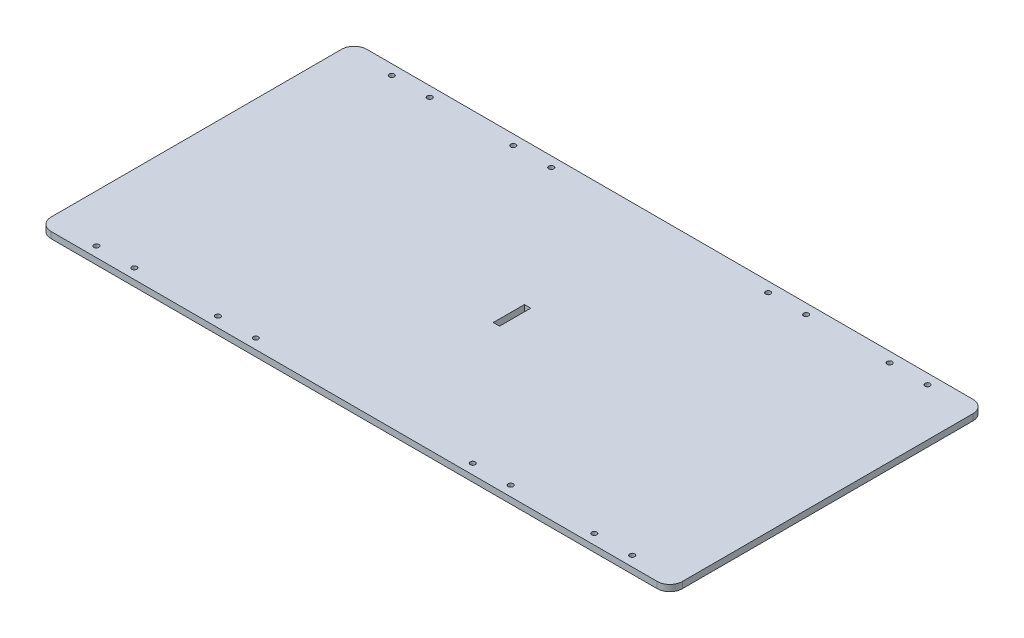
ISO-10303-21;
HEADER;
FILE_DESCRIPTION(('STEP AP214'),'2;1');
FILE_NAME('part.step','',(''),(''),'','','');
FILE_SCHEMA(('AUTOMOTIVE_DESIGN { 1 0 10303 214 1 1 1 1 }'));
ENDSEC;
DATA;
#1=APPLICATION_CONTEXT('core data for automotive mechanical design processes');
#2=APPLICATION_PROTOCOL_DEFINITION('international standard','automotive_design',2000,#1);
#3=PRODUCT_CONTEXT('',#1,'mechanical');
#4=PRODUCT('Part','Part','',(#3));
#5=PRODUCT_RELATED_PRODUCT_CATEGORY('part','',(#4));
#6=PRODUCT_DEFINITION_FORMATION('','',#4);
#7=PRODUCT_DEFINITION_CONTEXT('part definition',#1,'design');
#8=PRODUCT_DEFINITION('design','',#6,#7);
#9=PRODUCT_DEFINITION_SHAPE('','',#8);
#10=(LENGTH_UNIT() NAMED_UNIT(*) SI_UNIT(.MILLI.,.METRE.));
#11=(NAMED_UNIT(*) PLANE_ANGLE_UNIT() SI_UNIT($,.RADIAN.));
#12=(NAMED_UNIT(*) SI_UNIT($,.STERADIAN.) SOLID_ANGLE_UNIT());
#13=UNCERTAINTY_MEASURE_WITH_UNIT(LENGTH_MEASURE(1.E-05),#10,'distance_accuracy_value','');
#14=(GEOMETRIC_REPRESENTATION_CONTEXT(3) GLOBAL_UNCERTAINTY_ASSIGNED_CONTEXT((#13)) GLOBAL_UNIT_ASSIGNED_CONTEXT((#10,
#11,#12)) REPRESENTATION_CONTEXT('',''));
#15=CARTESIAN_POINT('',(0.,0.,0.));
#16=DIRECTION('',(0.,0.,1.));
#17=DIRECTION('',(1.,0.,0.));
#18=AXIS2_PLACEMENT_3D('',#15,#16,#17);
#19=CARTESIAN_POINT('',(240.,5.,-115.));
#20=DIRECTION('',(0.,-1.,0.));
#21=DIRECTION('',(0.,0.,-1.));
#22=AXIS2_PLACEMENT_3D('',#19,#20,#21);
#23=CYLINDRICAL_SURFACE('',#22,10.);
#24=CARTESIAN_POINT('',(240.,0.,-115.));
#25=DIRECTION('',(0.,1.,0.));
#26=DIRECTION('',(0.,0.,1.));
#27=AXIS2_PLACEMENT_3D('',#24,#25,#26);
#28=CIRCLE('',#27,10.);
#29=CARTESIAN_POINT('',(250.,0.,-115.));
#30=VERTEX_POINT('',#29);
#31=CARTESIAN_POINT('',(240.,0.,-125.));
#32=VERTEX_POINT('',#31);
#33=EDGE_CURVE('E263',#30,#32,#28,.T.);
#34=ORIENTED_EDGE('',*,*,#33,.T.);
#35=DIRECTION('',(0.,-1.,0.));
#36=VECTOR('',#35,1.);
#37=CARTESIAN_POINT('',(240.,5.,-125.));
#38=LINE('',#37,#36);
#39=CARTESIAN_POINT('',(240.,5.,-125.));
#40=VERTEX_POINT('',#39);
#41=EDGE_CURVE('E315',#40,#32,#38,.T.);
#42=ORIENTED_EDGE('',*,*,#41,.F.);
#43=CARTESIAN_POINT('',(240.,5.,-115.));
#44=DIRECTION('',(0.,1.,0.));
#45=DIRECTION('',(0.,0.,1.));
#46=AXIS2_PLACEMENT_3D('',#43,#44,#45);
#47=CIRCLE('',#46,10.);
#48=CARTESIAN_POINT('',(250.,5.,-115.));
#49=VERTEX_POINT('',#48);
#50=EDGE_CURVE('E236',#49,#40,#47,.T.);
#51=ORIENTED_EDGE('',*,*,#50,.F.);
#52=DIRECTION('',(0.,-1.,0.));
#53=VECTOR('',#52,1.);
#54=CARTESIAN_POINT('',(250.,5.,-115.));
#55=LINE('',#54,#53);
#56=EDGE_CURVE('E262',#49,#30,#55,.T.);
#57=ORIENTED_EDGE('',*,*,#56,.T.);
#58=EDGE_LOOP('',(#34,#42,#51,#57));
#59=FACE_BOUND('',#58,.T.);
#60=ADVANCED_FACE('F47',(#59),#23,.T.);
#61=CARTESIAN_POINT('',(240.,5.,-125.));
#62=DIRECTION('',(0.,0.,1.));
#63=DIRECTION('',(1.,0.,0.));
#64=AXIS2_PLACEMENT_3D('',#61,#62,#63);
#65=PLANE('',#64);
#66=DIRECTION('',(-1.,0.,0.));
#67=VECTOR('',#66,1.);
#68=CARTESIAN_POINT('',(240.,0.,-125.));
#69=LINE('',#68,#67);
#70=CARTESIAN_POINT('',(-240.,0.,-125.));
#71=VERTEX_POINT('',#70);
#72=EDGE_CURVE('E267',#32,#71,#69,.T.);
#73=ORIENTED_EDGE('',*,*,#72,.T.);
#74=DIRECTION('',(0.,-1.,0.));
#75=VECTOR('',#74,1.);
#76=CARTESIAN_POINT('',(-240.,5.,-125.));
#77=LINE('',#76,#75);
#78=CARTESIAN_POINT('',(-240.,5.,-125.));
#79=VERTEX_POINT('',#78);
#80=EDGE_CURVE('E311',#79,#71,#77,.T.);
#81=ORIENTED_EDGE('',*,*,#80,.F.);
#82=DIRECTION('',(-1.,0.,0.));
#83=VECTOR('',#82,1.);
#84=CARTESIAN_POINT('',(240.,5.,-125.));
#85=LINE('',#84,#83);
#86=EDGE_CURVE('E240',#40,#79,#85,.T.);
#87=ORIENTED_EDGE('',*,*,#86,.F.);
#88=ORIENTED_EDGE('',*,*,#41,.T.);
#89=EDGE_LOOP('',(#73,#81,#87,#88));
#90=FACE_BOUND('',#89,.T.);
#91=ADVANCED_FACE('F409',(#90),#65,.F.);
#92=CARTESIAN_POINT('',(-240.,5.,-115.));
#93=DIRECTION('',(0.,-1.,0.));
#94=DIRECTION('',(0.,0.,-1.));
#95=AXIS2_PLACEMENT_3D('',#92,#93,#94);
#96=CYLINDRICAL_SURFACE('',#95,10.);
#97=CARTESIAN_POINT('',(-240.,0.,-115.));
#98=DIRECTION('',(0.,1.,0.));
#99=DIRECTION('',(0.,0.,1.));
#100=AXIS2_PLACEMENT_3D('',#97,#98,#99);
#101=CIRCLE('',#100,10.);
#102=CARTESIAN_POINT('',(-250.,0.,-115.));
#103=VERTEX_POINT('',#102);
#104=EDGE_CURVE('E271',#71,#103,#101,.T.);
#105=ORIENTED_EDGE('',*,*,#104,.T.);
#106=DIRECTION('',(0.,-1.,0.));
#107=VECTOR('',#106,1.);
#108=CARTESIAN_POINT('',(-250.,5.,-115.));
#109=LINE('',#108,#107);
#110=CARTESIAN_POINT('',(-250.,5.,-115.));
#111=VERTEX_POINT('',#110);
#112=EDGE_CURVE('E307',#111,#103,#109,.T.);
#113=ORIENTED_EDGE('',*,*,#112,.F.);
#114=CARTESIAN_POINT('',(-240.,5.,-115.));
#115=DIRECTION('',(0.,1.,0.));
#116=DIRECTION('',(0.,0.,1.));
#117=AXIS2_PLACEMENT_3D('',#114,#115,#116);
#118=CIRCLE('',#117,10.);
#119=EDGE_CURVE('E244',#79,#111,#118,.T.);
#120=ORIENTED_EDGE('',*,*,#119,.F.);
#121=ORIENTED_EDGE('',*,*,#80,.T.);
#122=EDGE_LOOP('',(#105,#113,#120,#121));
#123=FACE_BOUND('',#122,.T.);
#124=ADVANCED_FACE('F414',(#123),#96,.T.);
#125=CARTESIAN_POINT('',(-250.,5.,115.));
#126=DIRECTION('',(1.,0.,0.));
#127=DIRECTION('',(0.,0.,-1.));
#128=AXIS2_PLACEMENT_3D('',#125,#126,#127);
#129=PLANE('',#128);
#130=DIRECTION('',(0.,0.,1.));
#131=VECTOR('',#130,1.);
#132=CARTESIAN_POINT('',(-250.,0.,115.));
#133=LINE('',#132,#131);
#134=CARTESIAN_POINT('',(-250.,0.,115.));
#135=VERTEX_POINT('',#134);
#136=EDGE_CURVE('E274',#103,#135,#133,.T.);
#137=ORIENTED_EDGE('',*,*,#136,.T.);
#138=DIRECTION('',(0.,-1.,0.));
#139=VECTOR('',#138,1.);
#140=CARTESIAN_POINT('',(-250.,5.,115.));
#141=LINE('',#140,#139);
#142=CARTESIAN_POINT('',(-250.,5.,115.));
#143=VERTEX_POINT('',#142);
#144=EDGE_CURVE('E303',#143,#135,#141,.T.);
#145=ORIENTED_EDGE('',*,*,#144,.F.);
#146=DIRECTION('',(0.,0.,1.));
#147=VECTOR('',#146,1.);
#148=CARTESIAN_POINT('',(-250.,5.,115.));
#149=LINE('',#148,#147);
#150=EDGE_CURVE('E247',#111,#143,#149,.T.);
#151=ORIENTED_EDGE('',*,*,#150,.F.);
#152=ORIENTED_EDGE('',*,*,#112,.T.);
#153=EDGE_LOOP('',(#137,#145,#151,#152));
#154=FACE_BOUND('',#153,.T.);
#155=ADVANCED_FACE('F448',(#154),#129,.F.);
#156=CARTESIAN_POINT('',(-240.,5.,115.));
#157=DIRECTION('',(0.,-1.,0.));
#158=DIRECTION('',(0.,0.,-1.));
#159=AXIS2_PLACEMENT_3D('',#156,#157,#158);
#160=CYLINDRICAL_SURFACE('',#159,10.);
#161=CARTESIAN_POINT('',(-240.,0.,115.));
#162=DIRECTION('',(0.,1.,0.));
#163=DIRECTION('',(0.,0.,-1.));
#164=AXIS2_PLACEMENT_3D('',#161,#162,#163);
#165=CIRCLE('',#164,10.);
#166=CARTESIAN_POINT('',(-240.,0.,125.));
#167=VERTEX_POINT('',#166);
#168=EDGE_CURVE('E277',#135,#167,#165,.T.);
#169=ORIENTED_EDGE('',*,*,#168,.T.);
#170=DIRECTION('',(0.,-1.,0.));
#171=VECTOR('',#170,1.);
#172=CARTESIAN_POINT('',(-240.,5.,125.));
#173=LINE('',#172,#171);
#174=CARTESIAN_POINT('',(-240.,5.,125.));
#175=VERTEX_POINT('',#174);
#176=EDGE_CURVE('E299',#175,#167,#173,.T.);
#177=ORIENTED_EDGE('',*,*,#176,.F.);
#178=CARTESIAN_POINT('',(-240.,5.,115.));
#179=DIRECTION('',(0.,1.,0.));
#180=DIRECTION('',(0.,0.,-1.));
#181=AXIS2_PLACEMENT_3D('',#178,#179,#180);
#182=CIRCLE('',#181,10.);
#183=EDGE_CURVE('E250',#143,#175,#182,.T.);
#184=ORIENTED_EDGE('',*,*,#183,.F.);
#185=ORIENTED_EDGE('',*,*,#144,.T.);
#186=EDGE_LOOP('',(#169,#177,#184,#185));
#187=FACE_BOUND('',#186,.T.);
#188=ADVANCED_FACE('F444',(#187),#160,.T.);
#189=CARTESIAN_POINT('',(240.,5.,125.));
#190=DIRECTION('',(0.,0.,-1.));
#191=DIRECTION('',(-1.,0.,0.));
#192=AXIS2_PLACEMENT_3D('',#189,#190,#191);
#193=PLANE('',#192);
#194=DIRECTION('',(1.,0.,0.));
#195=VECTOR('',#194,1.);
#196=CARTESIAN_POINT('',(240.,0.,125.));
#197=LINE('',#196,#195);
#198=CARTESIAN_POINT('',(240.,0.,125.));
#199=VERTEX_POINT('',#198);
#200=EDGE_CURVE('E280',#167,#199,#197,.T.);
#201=ORIENTED_EDGE('',*,*,#200,.T.);
#202=DIRECTION('',(0.,-1.,0.));
#203=VECTOR('',#202,1.);
#204=CARTESIAN_POINT('',(240.,5.,125.));
#205=LINE('',#204,#203);
#206=CARTESIAN_POINT('',(240.,5.,125.));
#207=VERTEX_POINT('',#206);
#208=EDGE_CURVE('E295',#207,#199,#205,.T.);
#209=ORIENTED_EDGE('',*,*,#208,.F.);
#210=DIRECTION('',(1.,0.,0.));
#211=VECTOR('',#210,1.);
#212=CARTESIAN_POINT('',(240.,5.,125.));
#213=LINE('',#212,#211);
#214=EDGE_CURVE('E253',#175,#207,#213,.T.);
#215=ORIENTED_EDGE('',*,*,#214,.F.);
#216=ORIENTED_EDGE('',*,*,#176,.T.);
#217=EDGE_LOOP('',(#201,#209,#215,#216));
#218=FACE_BOUND('',#217,.T.);
#219=ADVANCED_FACE('F439',(#218),#193,.F.);
#220=CARTESIAN_POINT('',(240.,5.,115.));
#221=DIRECTION('',(0.,-1.,0.));
#222=DIRECTION('',(0.,0.,-1.));
#223=AXIS2_PLACEMENT_3D('',#220,#221,#222);
#224=CYLINDRICAL_SURFACE('',#223,10.);
#225=CARTESIAN_POINT('',(240.,0.,115.));
#226=DIRECTION('',(0.,1.,0.));
#227=DIRECTION('',(0.,0.,1.));
#228=AXIS2_PLACEMENT_3D('',#225,#226,#227);
#229=CIRCLE('',#228,10.);
#230=CARTESIAN_POINT('',(250.,0.,115.));
#231=VERTEX_POINT('',#230);
#232=EDGE_CURVE('E283',#199,#231,#229,.T.);
#233=ORIENTED_EDGE('',*,*,#232,.T.);
#234=DIRECTION('',(0.,-1.,0.));
#235=VECTOR('',#234,1.);
#236=CARTESIAN_POINT('',(250.,5.,115.));
#237=LINE('',#236,#235);
#238=CARTESIAN_POINT('',(250.,5.,115.));
#239=VERTEX_POINT('',#238);
#240=EDGE_CURVE('E291',#239,#231,#237,.T.);
#241=ORIENTED_EDGE('',*,*,#240,.F.);
#242=CARTESIAN_POINT('',(240.,5.,115.));
#243=DIRECTION('',(0.,1.,0.));
#244=DIRECTION('',(0.,0.,1.));
#245=AXIS2_PLACEMENT_3D('',#242,#243,#244);
#246=CIRCLE('',#245,10.);
#247=EDGE_CURVE('E256',#207,#239,#246,.T.);
#248=ORIENTED_EDGE('',*,*,#247,.F.);
#249=ORIENTED_EDGE('',*,*,#208,.T.);
#250=EDGE_LOOP('',(#233,#241,#248,#249));
#251=FACE_BOUND('',#250,.T.);
#252=ADVANCED_FACE('F434',(#251),#224,.T.);
#253=CARTESIAN_POINT('',(250.,5.,115.));
#254=DIRECTION('',(-1.,0.,0.));
#255=DIRECTION('',(0.,0.,1.));
#256=AXIS2_PLACEMENT_3D('',#253,#254,#255);
#257=PLANE('',#256);
#258=DIRECTION('',(0.,0.,-1.));
#259=VECTOR('',#258,1.);
#260=CARTESIAN_POINT('',(250.,0.,115.));
#261=LINE('',#260,#259);
#262=EDGE_CURVE('E241',#231,#30,#261,.T.);
#263=ORIENTED_EDGE('',*,*,#262,.T.);
#264=ORIENTED_EDGE('',*,*,#56,.F.);
#265=DIRECTION('',(0.,0.,-1.));
#266=VECTOR('',#265,1.);
#267=CARTESIAN_POINT('',(250.,5.,115.));
#268=LINE('',#267,#266);
#269=EDGE_CURVE('E259',#239,#49,#268,.T.);
#270=ORIENTED_EDGE('',*,*,#269,.F.);
#271=ORIENTED_EDGE('',*,*,#240,.T.);
#272=EDGE_LOOP('',(#263,#264,#270,#271));
#273=FACE_BOUND('',#272,.T.);
#274=ADVANCED_FACE('F432',(#273),#257,.F.);
#275=CARTESIAN_POINT('',(240.,5.,-115.));
#276=DIRECTION('',(0.,1.,0.));
#277=DIRECTION('',(0.,0.,1.));
#278=AXIS2_PLACEMENT_3D('',#275,#276,#277);
#279=PLANE('',#278);
#280=DIRECTION('',(0.,0.,-1.));
#281=VECTOR('',#280,1.);
#282=CARTESIAN_POINT('',(2.5,5.,12.37));
#283=LINE('',#282,#281);
#284=CARTESIAN_POINT('',(2.5,5.,12.37));
#285=VERTEX_POINT('',#284);
#286=CARTESIAN_POINT('',(2.5,5.,-12.37));
#287=VERTEX_POINT('',#286);
#288=EDGE_CURVE('E62',#285,#287,#283,.T.);
#289=ORIENTED_EDGE('',*,*,#288,.F.);
#290=DIRECTION('',(1.,0.,0.));
#291=VECTOR('',#290,1.);
#292=CARTESIAN_POINT('',(-2.5,5.,12.37));
#293=LINE('',#292,#291);
#294=CARTESIAN_POINT('',(-2.5,5.,12.37));
#295=VERTEX_POINT('',#294);
#296=EDGE_CURVE('E157',#295,#285,#293,.T.);
#297=ORIENTED_EDGE('',*,*,#296,.F.);
#298=DIRECTION('',(0.,0.,1.));
#299=VECTOR('',#298,1.);
#300=CARTESIAN_POINT('',(-2.5,5.,12.37));
#301=LINE('',#300,#299);
#302=CARTESIAN_POINT('',(-2.5,5.,-12.37));
#303=VERTEX_POINT('',#302);
#304=EDGE_CURVE('E139',#303,#295,#301,.T.);
#305=ORIENTED_EDGE('',*,*,#304,.F.);
#306=DIRECTION('',(-1.,0.,0.));
#307=VECTOR('',#306,1.);
#308=CARTESIAN_POINT('',(-2.5,5.,-12.37));
#309=LINE('',#308,#307);
#310=EDGE_CURVE('E149',#287,#303,#309,.T.);
#311=ORIENTED_EDGE('',*,*,#310,.F.);
#312=EDGE_LOOP('',(#289,#297,#305,#311));
#313=FACE_BOUND('',#312,.T.);
#314=CARTESIAN_POINT('',(182.15,5.,116.98));
#315=DIRECTION('',(0.,1.,0.));
#316=DIRECTION('',(0.,0.,-1.));
#317=AXIS2_PLACEMENT_3D('',#314,#315,#316);
#318=CIRCLE('',#317,2.);
#319=CARTESIAN_POINT('',(182.15,5.,114.98));
#320=VERTEX_POINT('',#319);
#321=EDGE_CURVE('E208',#320,#320,#318,.T.);
#322=ORIENTED_EDGE('',*,*,#321,.F.);
#323=EDGE_LOOP('',(#322));
#324=FACE_BOUND('',#323,.T.);
#325=CARTESIAN_POINT('',(115.95,5.,116.98));
#326=DIRECTION('',(0.,1.,0.));
#327=DIRECTION('',(0.,0.,-1.));
#328=AXIS2_PLACEMENT_3D('',#325,#326,#327);
#329=CIRCLE('',#328,2.);
#330=CARTESIAN_POINT('',(115.95,5.,114.98));
#331=VERTEX_POINT('',#330);
#332=EDGE_CURVE('E204',#331,#331,#329,.T.);
#333=ORIENTED_EDGE('',*,*,#332,.F.);
#334=EDGE_LOOP('',(#333));
#335=FACE_BOUND('',#334,.T.);
#336=CARTESIAN_POINT('',(85.9000000000002,5.,116.98));
#337=DIRECTION('',(0.,1.,0.));
#338=DIRECTION('',(0.,0.,-1.));
#339=AXIS2_PLACEMENT_3D('',#336,#337,#338);
#340=CIRCLE('',#339,2.);
#341=CARTESIAN_POINT('',(85.9000000000002,5.,114.98));
#342=VERTEX_POINT('',#341);
#343=EDGE_CURVE('E200',#342,#342,#340,.T.);
#344=ORIENTED_EDGE('',*,*,#343,.F.);
#345=EDGE_LOOP('',(#344));
#346=FACE_BOUND('',#345,.T.);
#347=CARTESIAN_POINT('',(212.2,5.,-116.98));
#348=DIRECTION('',(0.,1.,0.));
#349=DIRECTION('',(0.,0.,1.));
#350=AXIS2_PLACEMENT_3D('',#347,#348,#349);
#351=CIRCLE('',#350,2.);
#352=CARTESIAN_POINT('',(212.2,5.,-114.98));
#353=VERTEX_POINT('',#352);
#354=EDGE_CURVE('E188',#353,#353,#351,.T.);
#355=ORIENTED_EDGE('',*,*,#354,.F.);
#356=EDGE_LOOP('',(#355));
#357=FACE_BOUND('',#356,.T.);
#358=CARTESIAN_POINT('',(212.2,5.,116.98));
#359=DIRECTION('',(0.,1.,0.));
#360=DIRECTION('',(0.,0.,-1.));
#361=AXIS2_PLACEMENT_3D('',#358,#359,#360);
#362=CIRCLE('',#361,2.);
#363=CARTESIAN_POINT('',(212.2,5.,114.98));
#364=VERTEX_POINT('',#363);
#365=EDGE_CURVE('E212',#364,#364,#362,.T.);
#366=ORIENTED_EDGE('',*,*,#365,.F.);
#367=EDGE_LOOP('',(#366));
#368=FACE_BOUND('',#367,.T.);
#369=CARTESIAN_POINT('',(-85.9000000000001,5.,116.98));
#370=DIRECTION('',(0.,1.,0.));
#371=DIRECTION('',(0.,0.,1.));
#372=AXIS2_PLACEMENT_3D('',#369,#370,#371);
#373=CIRCLE('',#372,2.);
#374=CARTESIAN_POINT('',(-85.9000000000001,5.,118.98));
#375=VERTEX_POINT('',#374);
#376=EDGE_CURVE('E225',#375,#375,#373,.T.);
#377=ORIENTED_EDGE('',*,*,#376,.F.);
#378=EDGE_LOOP('',(#377));
#379=FACE_BOUND('',#378,.T.);
#380=CARTESIAN_POINT('',(-115.95,5.,116.98));
#381=DIRECTION('',(0.,1.,0.));
#382=DIRECTION('',(0.,0.,1.));
#383=AXIS2_PLACEMENT_3D('',#380,#381,#382);
#384=CIRCLE('',#383,2.);
#385=CARTESIAN_POINT('',(-115.95,5.,118.98));
#386=VERTEX_POINT('',#385);
#387=EDGE_CURVE('E221',#386,#386,#384,.T.);
#388=ORIENTED_EDGE('',*,*,#387,.F.);
#389=EDGE_LOOP('',(#388));
#390=FACE_BOUND('',#389,.T.);
#391=CARTESIAN_POINT('',(-182.15,5.,116.98));
#392=DIRECTION('',(0.,1.,0.));
#393=DIRECTION('',(0.,0.,1.));
#394=AXIS2_PLACEMENT_3D('',#391,#392,#393);
#395=CIRCLE('',#394,2.);
#396=CARTESIAN_POINT('',(-182.15,5.,118.98));
#397=VERTEX_POINT('',#396);
#398=EDGE_CURVE('E216',#397,#397,#395,.T.);
#399=ORIENTED_EDGE('',*,*,#398,.F.);
#400=EDGE_LOOP('',(#399));
#401=FACE_BOUND('',#400,.T.);
#402=CARTESIAN_POINT('',(-212.2,5.,-116.98));
#403=DIRECTION('',(0.,1.,0.));
#404=DIRECTION('',(0.,0.,-1.));
#405=AXIS2_PLACEMENT_3D('',#402,#403,#404);
#406=CIRCLE('',#405,2.);
#407=CARTESIAN_POINT('',(-212.2,5.,-118.98));
#408=VERTEX_POINT('',#407);
#409=EDGE_CURVE('E176',#408,#408,#406,.T.);
#410=ORIENTED_EDGE('',*,*,#409,.F.);
#411=EDGE_LOOP('',(#410));
#412=FACE_BOUND('',#411,.T.);
#413=CARTESIAN_POINT('',(-85.9000000000001,5.,-116.98));
#414=DIRECTION('',(0.,1.,0.));
#415=DIRECTION('',(0.,0.,-1.));
#416=AXIS2_PLACEMENT_3D('',#413,#414,#415);
#417=CIRCLE('',#416,2.);
#418=CARTESIAN_POINT('',(-85.9000000000001,5.,-118.98));
#419=VERTEX_POINT('',#418);
#420=EDGE_CURVE('E175',#419,#419,#417,.T.);
#421=ORIENTED_EDGE('',*,*,#420,.F.);
#422=EDGE_LOOP('',(#421));
#423=FACE_BOUND('',#422,.T.);
#424=CARTESIAN_POINT('',(-115.95,5.,-116.98));
#425=DIRECTION('',(0.,1.,0.));
#426=DIRECTION('',(0.,0.,-1.));
#427=AXIS2_PLACEMENT_3D('',#424,#425,#426);
#428=CIRCLE('',#427,2.);
#429=CARTESIAN_POINT('',(-115.95,5.,-118.98));
#430=VERTEX_POINT('',#429);
#431=EDGE_CURVE('E167',#430,#430,#428,.T.);
#432=ORIENTED_EDGE('',*,*,#431,.F.);
#433=EDGE_LOOP('',(#432));
#434=FACE_BOUND('',#433,.T.);
#435=CARTESIAN_POINT('',(-182.15,5.,-116.98));
#436=DIRECTION('',(0.,1.,0.));
#437=DIRECTION('',(0.,0.,-1.));
#438=AXIS2_PLACEMENT_3D('',#435,#436,#437);
#439=CIRCLE('',#438,2.);
#440=CARTESIAN_POINT('',(-182.15,5.,-118.98));
#441=VERTEX_POINT('',#440);
#442=EDGE_CURVE('E180',#441,#441,#439,.T.);
#443=ORIENTED_EDGE('',*,*,#442,.F.);
#444=EDGE_LOOP('',(#443));
#445=FACE_BOUND('',#444,.T.);
#446=CARTESIAN_POINT('',(85.9000000000002,5.,-116.98));
#447=DIRECTION('',(0.,1.,0.));
#448=DIRECTION('',(0.,0.,1.));
#449=AXIS2_PLACEMENT_3D('',#446,#447,#448);
#450=CIRCLE('',#449,2.);
#451=CARTESIAN_POINT('',(85.9000000000002,5.,-114.98));
#452=VERTEX_POINT('',#451);
#453=EDGE_CURVE('E193',#452,#452,#450,.T.);
#454=ORIENTED_EDGE('',*,*,#453,.F.);
#455=EDGE_LOOP('',(#454));
#456=FACE_BOUND('',#455,.T.);
#457=CARTESIAN_POINT('',(115.95,5.,-116.98));
#458=DIRECTION('',(0.,1.,0.));
#459=DIRECTION('',(0.,0.,1.));
#460=AXIS2_PLACEMENT_3D('',#457,#458,#459);
#461=CIRCLE('',#460,2.);
#462=CARTESIAN_POINT('',(115.95,5.,-114.98));
#463=VERTEX_POINT('',#462);
#464=EDGE_CURVE('E189',#463,#463,#461,.T.);
#465=ORIENTED_EDGE('',*,*,#464,.F.);
#466=EDGE_LOOP('',(#465));
#467=FACE_BOUND('',#466,.T.);
#468=CARTESIAN_POINT('',(182.15,5.,-116.98));
#469=DIRECTION('',(0.,1.,0.));
#470=DIRECTION('',(0.,0.,1.));
#471=AXIS2_PLACEMENT_3D('',#468,#469,#470);
#472=CIRCLE('',#471,2.);
#473=CARTESIAN_POINT('',(182.15,5.,-114.98));
#474=VERTEX_POINT('',#473);
#475=EDGE_CURVE('E184',#474,#474,#472,.T.);
#476=ORIENTED_EDGE('',*,*,#475,.F.);
#477=EDGE_LOOP('',(#476));
#478=FACE_BOUND('',#477,.T.);
#479=CARTESIAN_POINT('',(-212.2,5.,116.98));
#480=DIRECTION('',(0.,1.,0.));
#481=DIRECTION('',(0.,0.,1.));
#482=AXIS2_PLACEMENT_3D('',#479,#480,#481);
#483=CIRCLE('',#482,2.);
#484=CARTESIAN_POINT('',(-212.2,5.,118.98));
#485=VERTEX_POINT('',#484);
#486=EDGE_CURVE('E220',#485,#485,#483,.T.);
#487=ORIENTED_EDGE('',*,*,#486,.F.);
#488=EDGE_LOOP('',(#487));
#489=FACE_BOUND('',#488,.T.);
#490=ORIENTED_EDGE('',*,*,#50,.T.);
#491=ORIENTED_EDGE('',*,*,#86,.T.);
#492=ORIENTED_EDGE('',*,*,#119,.T.);
#493=ORIENTED_EDGE('',*,*,#150,.T.);
#494=ORIENTED_EDGE('',*,*,#183,.T.);
#495=ORIENTED_EDGE('',*,*,#214,.T.);
#496=ORIENTED_EDGE('',*,*,#247,.T.);
#497=ORIENTED_EDGE('',*,*,#269,.T.);
#498=EDGE_LOOP('',(#490,#491,#492,#493,#494,#495,#496,#497));
#499=FACE_BOUND('',#498,.T.);
#500=ADVANCED_FACE('F154',(#313,#324,#335,#346,#357,#368,#379,#390,#401,#412,#423,#434,#445,
#456,#467,#478,#489,#499),#279,.T.);
#501=CARTESIAN_POINT('',(240.,0.,-115.));
#502=DIRECTION('',(0.,1.,0.));
#503=DIRECTION('',(0.,0.,1.));
#504=AXIS2_PLACEMENT_3D('',#501,#502,#503);
#505=PLANE('',#504);
#506=DIRECTION('',(1.,0.,0.));
#507=VECTOR('',#506,1.);
#508=CARTESIAN_POINT('',(240.,0.,12.37));
#509=LINE('',#508,#507);
#510=CARTESIAN_POINT('',(-2.5,0.,12.37));
#511=VERTEX_POINT('',#510);
#512=CARTESIAN_POINT('',(2.5,0.,12.37));
#513=VERTEX_POINT('',#512);
#514=EDGE_CURVE('E55',#511,#513,#509,.T.);
#515=ORIENTED_EDGE('',*,*,#514,.T.);
#516=DIRECTION('',(0.,0.,-1.));
#517=VECTOR('',#516,1.);
#518=CARTESIAN_POINT('',(2.5,0.,-115.));
#519=LINE('',#518,#517);
#520=CARTESIAN_POINT('',(2.5,0.,-12.37));
#521=VERTEX_POINT('',#520);
#522=EDGE_CURVE('E11',#513,#521,#519,.T.);
#523=ORIENTED_EDGE('',*,*,#522,.T.);
#524=DIRECTION('',(-1.,0.,0.));
#525=VECTOR('',#524,1.);
#526=CARTESIAN_POINT('',(240.,0.,-12.37));
#527=LINE('',#526,#525);
#528=CARTESIAN_POINT('',(-2.5,0.,-12.37));
#529=VERTEX_POINT('',#528);
#530=EDGE_CURVE('E319',#521,#529,#527,.T.);
#531=ORIENTED_EDGE('',*,*,#530,.T.);
#532=DIRECTION('',(0.,0.,1.));
#533=VECTOR('',#532,1.);
#534=CARTESIAN_POINT('',(-2.5,0.,-115.));
#535=LINE('',#534,#533);
#536=EDGE_CURVE('E142',#529,#511,#535,.T.);
#537=ORIENTED_EDGE('',*,*,#536,.T.);
#538=EDGE_LOOP('',(#515,#523,#531,#537));
#539=FACE_BOUND('',#538,.T.);
#540=CARTESIAN_POINT('',(182.15,0.,116.98));
#541=DIRECTION('',(0.,1.,0.));
#542=DIRECTION('',(0.,0.,1.));
#543=AXIS2_PLACEMENT_3D('',#540,#541,#542);
#544=CIRCLE('',#543,2.);
#545=CARTESIAN_POINT('',(182.15,0.,118.98));
#546=VERTEX_POINT('',#545);
#547=EDGE_CURVE('E268',#546,#546,#544,.T.);
#548=ORIENTED_EDGE('',*,*,#547,.T.);
#549=EDGE_LOOP('',(#548));
#550=FACE_BOUND('',#549,.T.);
#551=CARTESIAN_POINT('',(115.95,0.,116.98));
#552=DIRECTION('',(0.,1.,0.));
#553=DIRECTION('',(0.,0.,1.));
#554=AXIS2_PLACEMENT_3D('',#551,#552,#553);
#555=CIRCLE('',#554,2.);
#556=CARTESIAN_POINT('',(115.95,0.,118.98));
#557=VERTEX_POINT('',#556);
#558=EDGE_CURVE('E375',#557,#557,#555,.T.);
#559=ORIENTED_EDGE('',*,*,#558,.T.);
#560=EDGE_LOOP('',(#559));
#561=FACE_BOUND('',#560,.T.);
#562=CARTESIAN_POINT('',(85.9000000000002,0.,116.98));
#563=DIRECTION('',(0.,1.,0.));
#564=DIRECTION('',(0.,0.,1.));
#565=AXIS2_PLACEMENT_3D('',#562,#563,#564);
#566=CIRCLE('',#565,2.);
#567=CARTESIAN_POINT('',(85.9000000000002,0.,118.98));
#568=VERTEX_POINT('',#567);
#569=EDGE_CURVE('E371',#568,#568,#566,.T.);
#570=ORIENTED_EDGE('',*,*,#569,.T.);
#571=EDGE_LOOP('',(#570));
#572=FACE_BOUND('',#571,.T.);
#573=CARTESIAN_POINT('',(212.2,0.,-116.98));
#574=DIRECTION('',(0.,1.,0.));
#575=DIRECTION('',(0.,0.,1.));
#576=AXIS2_PLACEMENT_3D('',#573,#574,#575);
#577=CIRCLE('',#576,2.);
#578=CARTESIAN_POINT('',(212.2,0.,-114.98));
#579=VERTEX_POINT('',#578);
#580=EDGE_CURVE('E367',#579,#579,#577,.T.);
#581=ORIENTED_EDGE('',*,*,#580,.T.);
#582=EDGE_LOOP('',(#581));
#583=FACE_BOUND('',#582,.T.);
#584=CARTESIAN_POINT('',(212.2,0.,116.98));
#585=DIRECTION('',(0.,1.,0.));
#586=DIRECTION('',(0.,0.,1.));
#587=AXIS2_PLACEMENT_3D('',#584,#585,#586);
#588=CIRCLE('',#587,2.);
#589=CARTESIAN_POINT('',(212.2,0.,118.98));
#590=VERTEX_POINT('',#589);
#591=EDGE_CURVE('E363',#590,#590,#588,.T.);
#592=ORIENTED_EDGE('',*,*,#591,.T.);
#593=EDGE_LOOP('',(#592));
#594=FACE_BOUND('',#593,.T.);
#595=CARTESIAN_POINT('',(-85.9000000000001,0.,116.98));
#596=DIRECTION('',(0.,1.,0.));
#597=DIRECTION('',(0.,0.,1.));
#598=AXIS2_PLACEMENT_3D('',#595,#596,#597);
#599=CIRCLE('',#598,2.);
#600=CARTESIAN_POINT('',(-85.9000000000001,0.,118.98));
#601=VERTEX_POINT('',#600);
#602=EDGE_CURVE('E359',#601,#601,#599,.T.);
#603=ORIENTED_EDGE('',*,*,#602,.T.);
#604=EDGE_LOOP('',(#603));
#605=FACE_BOUND('',#604,.T.);
#606=CARTESIAN_POINT('',(-115.95,0.,116.98));
#607=DIRECTION('',(0.,1.,0.));
#608=DIRECTION('',(0.,0.,1.));
#609=AXIS2_PLACEMENT_3D('',#606,#607,#608);
#610=CIRCLE('',#609,2.);
#611=CARTESIAN_POINT('',(-115.95,0.,118.98));
#612=VERTEX_POINT('',#611);
#613=EDGE_CURVE('E355',#612,#612,#610,.T.);
#614=ORIENTED_EDGE('',*,*,#613,.T.);
#615=EDGE_LOOP('',(#614));
#616=FACE_BOUND('',#615,.T.);
#617=CARTESIAN_POINT('',(-182.15,0.,116.98));
#618=DIRECTION('',(0.,1.,0.));
#619=DIRECTION('',(0.,0.,1.));
#620=AXIS2_PLACEMENT_3D('',#617,#618,#619);
#621=CIRCLE('',#620,2.);
#622=CARTESIAN_POINT('',(-182.15,0.,118.98));
#623=VERTEX_POINT('',#622);
#624=EDGE_CURVE('E351',#623,#623,#621,.T.);
#625=ORIENTED_EDGE('',*,*,#624,.T.);
#626=EDGE_LOOP('',(#625));
#627=FACE_BOUND('',#626,.T.);
#628=CARTESIAN_POINT('',(-212.2,0.,-116.98));
#629=DIRECTION('',(0.,1.,0.));
#630=DIRECTION('',(0.,0.,1.));
#631=AXIS2_PLACEMENT_3D('',#628,#629,#630);
#632=CIRCLE('',#631,2.);
#633=CARTESIAN_POINT('',(-212.2,0.,-114.98));
#634=VERTEX_POINT('',#633);
#635=EDGE_CURVE('E347',#634,#634,#632,.T.);
#636=ORIENTED_EDGE('',*,*,#635,.T.);
#637=EDGE_LOOP('',(#636));
#638=FACE_BOUND('',#637,.T.);
#639=CARTESIAN_POINT('',(-85.9000000000001,0.,-116.98));
#640=DIRECTION('',(0.,1.,0.));
#641=DIRECTION('',(0.,0.,1.));
#642=AXIS2_PLACEMENT_3D('',#639,#640,#641);
#643=CIRCLE('',#642,2.);
#644=CARTESIAN_POINT('',(-85.9000000000001,0.,-114.98));
#645=VERTEX_POINT('',#644);
#646=EDGE_CURVE('E343',#645,#645,#643,.T.);
#647=ORIENTED_EDGE('',*,*,#646,.T.);
#648=EDGE_LOOP('',(#647));
#649=FACE_BOUND('',#648,.T.);
#650=CARTESIAN_POINT('',(-115.95,0.,-116.98));
#651=DIRECTION('',(0.,1.,0.));
#652=DIRECTION('',(0.,0.,1.));
#653=AXIS2_PLACEMENT_3D('',#650,#651,#652);
#654=CIRCLE('',#653,2.);
#655=CARTESIAN_POINT('',(-115.95,0.,-114.98));
#656=VERTEX_POINT('',#655);
#657=EDGE_CURVE('E339',#656,#656,#654,.T.);
#658=ORIENTED_EDGE('',*,*,#657,.T.);
#659=EDGE_LOOP('',(#658));
#660=FACE_BOUND('',#659,.T.);
#661=CARTESIAN_POINT('',(-182.15,0.,-116.98));
#662=DIRECTION('',(0.,1.,0.));
#663=DIRECTION('',(0.,0.,1.));
#664=AXIS2_PLACEMENT_3D('',#661,#662,#663);
#665=CIRCLE('',#664,2.);
#666=CARTESIAN_POINT('',(-182.15,0.,-114.98));
#667=VERTEX_POINT('',#666);
#668=EDGE_CURVE('E335',#667,#667,#665,.T.);
#669=ORIENTED_EDGE('',*,*,#668,.T.);
#670=EDGE_LOOP('',(#669));
#671=FACE_BOUND('',#670,.T.);
#672=CARTESIAN_POINT('',(85.9000000000002,0.,-116.98));
#673=DIRECTION('',(0.,1.,0.));
#674=DIRECTION('',(0.,0.,1.));
#675=AXIS2_PLACEMENT_3D('',#672,#673,#674);
#676=CIRCLE('',#675,2.);
#677=CARTESIAN_POINT('',(85.9000000000002,0.,-114.98));
#678=VERTEX_POINT('',#677);
#679=EDGE_CURVE('E331',#678,#678,#676,.T.);
#680=ORIENTED_EDGE('',*,*,#679,.T.);
#681=EDGE_LOOP('',(#680));
#682=FACE_BOUND('',#681,.T.);
#683=CARTESIAN_POINT('',(115.95,0.,-116.98));
#684=DIRECTION('',(0.,1.,0.));
#685=DIRECTION('',(0.,0.,1.));
#686=AXIS2_PLACEMENT_3D('',#683,#684,#685);
#687=CIRCLE('',#686,2.);
#688=CARTESIAN_POINT('',(115.95,0.,-114.98));
#689=VERTEX_POINT('',#688);
#690=EDGE_CURVE('E327',#689,#689,#687,.T.);
#691=ORIENTED_EDGE('',*,*,#690,.T.);
#692=EDGE_LOOP('',(#691));
#693=FACE_BOUND('',#692,.T.);
#694=CARTESIAN_POINT('',(182.15,0.,-116.98));
#695=DIRECTION('',(0.,1.,0.));
#696=DIRECTION('',(0.,0.,1.));
#697=AXIS2_PLACEMENT_3D('',#694,#695,#696);
#698=CIRCLE('',#697,2.);
#699=CARTESIAN_POINT('',(182.15,0.,-114.98));
#700=VERTEX_POINT('',#699);
#701=EDGE_CURVE('E323',#700,#700,#698,.T.);
#702=ORIENTED_EDGE('',*,*,#701,.T.);
#703=EDGE_LOOP('',(#702));
#704=FACE_BOUND('',#703,.T.);
#705=CARTESIAN_POINT('',(-212.2,0.,116.98));
#706=DIRECTION('',(0.,1.,0.));
#707=DIRECTION('',(0.,0.,1.));
#708=AXIS2_PLACEMENT_3D('',#705,#706,#707);
#709=CIRCLE('',#708,2.);
#710=CARTESIAN_POINT('',(-212.2,0.,118.98));
#711=VERTEX_POINT('',#710);
#712=EDGE_CURVE('E235',#711,#711,#709,.T.);
#713=ORIENTED_EDGE('',*,*,#712,.T.);
#714=EDGE_LOOP('',(#713));
#715=FACE_BOUND('',#714,.T.);
#716=ORIENTED_EDGE('',*,*,#33,.F.);
#717=ORIENTED_EDGE('',*,*,#262,.F.);
#718=ORIENTED_EDGE('',*,*,#232,.F.);
#719=ORIENTED_EDGE('',*,*,#200,.F.);
#720=ORIENTED_EDGE('',*,*,#168,.F.);
#721=ORIENTED_EDGE('',*,*,#136,.F.);
#722=ORIENTED_EDGE('',*,*,#104,.F.);
#723=ORIENTED_EDGE('',*,*,#72,.F.);
#724=EDGE_LOOP('',(#716,#717,#718,#719,#720,#721,#722,#723));
#725=FACE_BOUND('',#724,.T.);
#726=ADVANCED_FACE('F388',(#539,#550,#561,#572,#583,#594,#605,#616,#627,#638,#649,#660,#671,
#682,#693,#704,#715,#725),#505,.F.);
#727=CARTESIAN_POINT('',(-212.2,-5.,116.98));
#728=DIRECTION('',(0.,1.,0.));
#729=DIRECTION('',(0.,0.,1.));
#730=AXIS2_PLACEMENT_3D('',#727,#728,#729);
#731=CYLINDRICAL_SURFACE('',#730,2.);
#732=ORIENTED_EDGE('',*,*,#486,.T.);
#733=EDGE_LOOP('',(#732));
#734=FACE_BOUND('',#733,.T.);
#735=ORIENTED_EDGE('',*,*,#712,.F.);
#736=EDGE_LOOP('',(#735));
#737=FACE_BOUND('',#736,.T.);
#738=ADVANCED_FACE('F467',(#734,#737),#731,.F.);
#739=CARTESIAN_POINT('',(182.15,-5.,-116.98));
#740=DIRECTION('',(0.,1.,0.));
#741=DIRECTION('',(0.,0.,1.));
#742=AXIS2_PLACEMENT_3D('',#739,#740,#741);
#743=CYLINDRICAL_SURFACE('',#742,2.);
#744=ORIENTED_EDGE('',*,*,#475,.T.);
#745=EDGE_LOOP('',(#744));
#746=FACE_BOUND('',#745,.T.);
#747=ORIENTED_EDGE('',*,*,#701,.F.);
#748=EDGE_LOOP('',(#747));
#749=FACE_BOUND('',#748,.T.);
#750=ADVANCED_FACE('F472',(#746,#749),#743,.F.);
#751=CARTESIAN_POINT('',(115.95,-5.,-116.98));
#752=DIRECTION('',(0.,1.,0.));
#753=DIRECTION('',(0.,0.,1.));
#754=AXIS2_PLACEMENT_3D('',#751,#752,#753);
#755=CYLINDRICAL_SURFACE('',#754,2.);
#756=ORIENTED_EDGE('',*,*,#464,.T.);
#757=EDGE_LOOP('',(#756));
#758=FACE_BOUND('',#757,.T.);
#759=ORIENTED_EDGE('',*,*,#690,.F.);
#760=EDGE_LOOP('',(#759));
#761=FACE_BOUND('',#760,.T.);
#762=ADVANCED_FACE('F510',(#758,#761),#755,.F.);
#763=CARTESIAN_POINT('',(85.9000000000002,-5.,-116.98));
#764=DIRECTION('',(0.,1.,0.));
#765=DIRECTION('',(0.,0.,1.));
#766=AXIS2_PLACEMENT_3D('',#763,#764,#765);
#767=CYLINDRICAL_SURFACE('',#766,2.);
#768=ORIENTED_EDGE('',*,*,#453,.T.);
#769=EDGE_LOOP('',(#768));
#770=FACE_BOUND('',#769,.T.);
#771=ORIENTED_EDGE('',*,*,#679,.F.);
#772=EDGE_LOOP('',(#771));
#773=FACE_BOUND('',#772,.T.);
#774=ADVANCED_FACE('F506',(#770,#773),#767,.F.);
#775=CARTESIAN_POINT('',(-182.15,-5.,-116.98));
#776=DIRECTION('',(0.,1.,0.));
#777=DIRECTION('',(0.,0.,1.));
#778=AXIS2_PLACEMENT_3D('',#775,#776,#777);
#779=CYLINDRICAL_SURFACE('',#778,2.);
#780=ORIENTED_EDGE('',*,*,#442,.T.);
#781=EDGE_LOOP('',(#780));
#782=FACE_BOUND('',#781,.T.);
#783=ORIENTED_EDGE('',*,*,#668,.F.);
#784=EDGE_LOOP('',(#783));
#785=FACE_BOUND('',#784,.T.);
#786=ADVANCED_FACE('F502',(#782,#785),#779,.F.);
#787=CARTESIAN_POINT('',(-115.95,-5.,-116.98));
#788=DIRECTION('',(0.,1.,0.));
#789=DIRECTION('',(0.,0.,1.));
#790=AXIS2_PLACEMENT_3D('',#787,#788,#789);
#791=CYLINDRICAL_SURFACE('',#790,2.);
#792=ORIENTED_EDGE('',*,*,#431,.T.);
#793=EDGE_LOOP('',(#792));
#794=FACE_BOUND('',#793,.T.);
#795=ORIENTED_EDGE('',*,*,#657,.F.);
#796=EDGE_LOOP('',(#795));
#797=FACE_BOUND('',#796,.T.);
#798=ADVANCED_FACE('F505',(#794,#797),#791,.F.);
#799=CARTESIAN_POINT('',(-85.9000000000001,-5.,-116.98));
#800=DIRECTION('',(0.,1.,0.));
#801=DIRECTION('',(0.,0.,1.));
#802=AXIS2_PLACEMENT_3D('',#799,#800,#801);
#803=CYLINDRICAL_SURFACE('',#802,2.);
#804=ORIENTED_EDGE('',*,*,#420,.T.);
#805=EDGE_LOOP('',(#804));
#806=FACE_BOUND('',#805,.T.);
#807=ORIENTED_EDGE('',*,*,#646,.F.);
#808=EDGE_LOOP('',(#807));
#809=FACE_BOUND('',#808,.T.);
#810=ADVANCED_FACE('F518',(#806,#809),#803,.F.);
#811=CARTESIAN_POINT('',(-212.2,-5.,-116.98));
#812=DIRECTION('',(0.,1.,0.));
#813=DIRECTION('',(0.,0.,1.));
#814=AXIS2_PLACEMENT_3D('',#811,#812,#813);
#815=CYLINDRICAL_SURFACE('',#814,2.);
#816=ORIENTED_EDGE('',*,*,#409,.T.);
#817=EDGE_LOOP('',(#816));
#818=FACE_BOUND('',#817,.T.);
#819=ORIENTED_EDGE('',*,*,#635,.F.);
#820=EDGE_LOOP('',(#819));
#821=FACE_BOUND('',#820,.T.);
#822=ADVANCED_FACE('F490',(#818,#821),#815,.F.);
#823=CARTESIAN_POINT('',(-182.15,-5.,116.98));
#824=DIRECTION('',(0.,1.,0.));
#825=DIRECTION('',(0.,0.,1.));
#826=AXIS2_PLACEMENT_3D('',#823,#824,#825);
#827=CYLINDRICAL_SURFACE('',#826,2.);
#828=ORIENTED_EDGE('',*,*,#398,.T.);
#829=EDGE_LOOP('',(#828));
#830=FACE_BOUND('',#829,.T.);
#831=ORIENTED_EDGE('',*,*,#624,.F.);
#832=EDGE_LOOP('',(#831));
#833=FACE_BOUND('',#832,.T.);
#834=ADVANCED_FACE('F486',(#830,#833),#827,.F.);
#835=CARTESIAN_POINT('',(-115.95,-5.,116.98));
#836=DIRECTION('',(0.,1.,0.));
#837=DIRECTION('',(0.,0.,1.));
#838=AXIS2_PLACEMENT_3D('',#835,#836,#837);
#839=CYLINDRICAL_SURFACE('',#838,2.);
#840=ORIENTED_EDGE('',*,*,#387,.T.);
#841=EDGE_LOOP('',(#840));
#842=FACE_BOUND('',#841,.T.);
#843=ORIENTED_EDGE('',*,*,#613,.F.);
#844=EDGE_LOOP('',(#843));
#845=FACE_BOUND('',#844,.T.);
#846=ADVANCED_FACE('F482',(#842,#845),#839,.F.);
#847=CARTESIAN_POINT('',(-85.9000000000001,-5.,116.98));
#848=DIRECTION('',(0.,1.,0.));
#849=DIRECTION('',(0.,0.,1.));
#850=AXIS2_PLACEMENT_3D('',#847,#848,#849);
#851=CYLINDRICAL_SURFACE('',#850,2.);
#852=ORIENTED_EDGE('',*,*,#376,.T.);
#853=EDGE_LOOP('',(#852));
#854=FACE_BOUND('',#853,.T.);
#855=ORIENTED_EDGE('',*,*,#602,.F.);
#856=EDGE_LOOP('',(#855));
#857=FACE_BOUND('',#856,.T.);
#858=ADVANCED_FACE('F478',(#854,#857),#851,.F.);
#859=CARTESIAN_POINT('',(212.2,-5.,116.98));
#860=DIRECTION('',(0.,1.,0.));
#861=DIRECTION('',(0.,0.,1.));
#862=AXIS2_PLACEMENT_3D('',#859,#860,#861);
#863=CYLINDRICAL_SURFACE('',#862,2.);
#864=ORIENTED_EDGE('',*,*,#365,.T.);
#865=EDGE_LOOP('',(#864));
#866=FACE_BOUND('',#865,.T.);
#867=ORIENTED_EDGE('',*,*,#591,.F.);
#868=EDGE_LOOP('',(#867));
#869=FACE_BOUND('',#868,.T.);
#870=ADVANCED_FACE('F474',(#866,#869),#863,.F.);
#871=CARTESIAN_POINT('',(212.2,-5.,-116.98));
#872=DIRECTION('',(0.,1.,0.));
#873=DIRECTION('',(0.,0.,1.));
#874=AXIS2_PLACEMENT_3D('',#871,#872,#873);
#875=CYLINDRICAL_SURFACE('',#874,2.);
#876=ORIENTED_EDGE('',*,*,#354,.T.);
#877=EDGE_LOOP('',(#876));
#878=FACE_BOUND('',#877,.T.);
#879=ORIENTED_EDGE('',*,*,#580,.F.);
#880=EDGE_LOOP('',(#879));
#881=FACE_BOUND('',#880,.T.);
#882=ADVANCED_FACE('F477',(#878,#881),#875,.F.);
#883=CARTESIAN_POINT('',(85.9000000000002,-5.,116.98));
#884=DIRECTION('',(0.,1.,0.));
#885=DIRECTION('',(0.,0.,1.));
#886=AXIS2_PLACEMENT_3D('',#883,#884,#885);
#887=CYLINDRICAL_SURFACE('',#886,2.);
#888=ORIENTED_EDGE('',*,*,#343,.T.);
#889=EDGE_LOOP('',(#888));
#890=FACE_BOUND('',#889,.T.);
#891=ORIENTED_EDGE('',*,*,#569,.F.);
#892=EDGE_LOOP('',(#891));
#893=FACE_BOUND('',#892,.T.);
#894=ADVANCED_FACE('F493',(#890,#893),#887,.F.);
#895=CARTESIAN_POINT('',(115.95,-5.,116.98));
#896=DIRECTION('',(0.,1.,0.));
#897=DIRECTION('',(0.,0.,1.));
#898=AXIS2_PLACEMENT_3D('',#895,#896,#897);
#899=CYLINDRICAL_SURFACE('',#898,2.);
#900=ORIENTED_EDGE('',*,*,#332,.T.);
#901=EDGE_LOOP('',(#900));
#902=FACE_BOUND('',#901,.T.);
#903=ORIENTED_EDGE('',*,*,#558,.F.);
#904=EDGE_LOOP('',(#903));
#905=FACE_BOUND('',#904,.T.);
#906=ADVANCED_FACE('F403',(#902,#905),#899,.F.);
#907=CARTESIAN_POINT('',(182.15,-5.,116.98));
#908=DIRECTION('',(0.,1.,0.));
#909=DIRECTION('',(0.,0.,1.));
#910=AXIS2_PLACEMENT_3D('',#907,#908,#909);
#911=CYLINDRICAL_SURFACE('',#910,2.);
#912=ORIENTED_EDGE('',*,*,#321,.T.);
#913=EDGE_LOOP('',(#912));
#914=FACE_BOUND('',#913,.T.);
#915=ORIENTED_EDGE('',*,*,#547,.F.);
#916=EDGE_LOOP('',(#915));
#917=FACE_BOUND('',#916,.T.);
#918=ADVANCED_FACE('F395',(#914,#917),#911,.F.);
#919=CARTESIAN_POINT('',(2.5,-5.,12.37));
#920=DIRECTION('',(1.,0.,0.));
#921=DIRECTION('',(0.,0.,-1.));
#922=AXIS2_PLACEMENT_3D('',#919,#920,#921);
#923=PLANE('',#922);
#924=DIRECTION('',(0.,1.,0.));
#925=VECTOR('',#924,1.);
#926=CARTESIAN_POINT('',(2.5,-5.,12.37));
#927=LINE('',#926,#925);
#928=EDGE_CURVE('E164',#513,#285,#927,.T.);
#929=ORIENTED_EDGE('',*,*,#928,.T.);
#930=ORIENTED_EDGE('',*,*,#288,.T.);
#931=DIRECTION('',(0.,1.,0.));
#932=VECTOR('',#931,1.);
#933=CARTESIAN_POINT('',(2.5,-5.,-12.37));
#934=LINE('',#933,#932);
#935=EDGE_CURVE('E146',#521,#287,#934,.T.);
#936=ORIENTED_EDGE('',*,*,#935,.F.);
#937=ORIENTED_EDGE('',*,*,#522,.F.);
#938=EDGE_LOOP('',(#929,#930,#936,#937));
#939=FACE_BOUND('',#938,.T.);
#940=ADVANCED_FACE('F393',(#939),#923,.F.);
#941=CARTESIAN_POINT('',(-2.5,-5.,12.37));
#942=DIRECTION('',(0.,0.,1.));
#943=DIRECTION('',(1.,0.,0.));
#944=AXIS2_PLACEMENT_3D('',#941,#942,#943);
#945=PLANE('',#944);
#946=DIRECTION('',(0.,1.,0.));
#947=VECTOR('',#946,1.);
#948=CARTESIAN_POINT('',(-2.5,-5.,12.37));
#949=LINE('',#948,#947);
#950=EDGE_CURVE('E145',#511,#295,#949,.T.);
#951=ORIENTED_EDGE('',*,*,#950,.T.);
#952=ORIENTED_EDGE('',*,*,#296,.T.);
#953=ORIENTED_EDGE('',*,*,#928,.F.);
#954=ORIENTED_EDGE('',*,*,#514,.F.);
#955=EDGE_LOOP('',(#951,#952,#953,#954));
#956=FACE_BOUND('',#955,.T.);
#957=ADVANCED_FACE('F392',(#956),#945,.F.);
#958=CARTESIAN_POINT('',(-2.5,-5.,12.37));
#959=DIRECTION('',(-1.,0.,0.));
#960=DIRECTION('',(0.,0.,1.));
#961=AXIS2_PLACEMENT_3D('',#958,#959,#960);
#962=PLANE('',#961);
#963=DIRECTION('',(0.,1.,0.));
#964=VECTOR('',#963,1.);
#965=CARTESIAN_POINT('',(-2.5,-5.,-12.37));
#966=LINE('',#965,#964);
#967=EDGE_CURVE('E70',#529,#303,#966,.T.);
#968=ORIENTED_EDGE('',*,*,#967,.T.);
#969=ORIENTED_EDGE('',*,*,#304,.T.);
#970=ORIENTED_EDGE('',*,*,#950,.F.);
#971=ORIENTED_EDGE('',*,*,#536,.F.);
#972=EDGE_LOOP('',(#968,#969,#970,#971));
#973=FACE_BOUND('',#972,.T.);
#974=ADVANCED_FACE('F136',(#973),#962,.F.);
#975=CARTESIAN_POINT('',(-2.5,-5.,-12.37));
#976=DIRECTION('',(0.,0.,-1.));
#977=DIRECTION('',(-1.,0.,0.));
#978=AXIS2_PLACEMENT_3D('',#975,#976,#977);
#979=PLANE('',#978);
#980=ORIENTED_EDGE('',*,*,#935,.T.);
#981=ORIENTED_EDGE('',*,*,#310,.T.);
#982=ORIENTED_EDGE('',*,*,#967,.F.);
#983=ORIENTED_EDGE('',*,*,#530,.F.);
#984=EDGE_LOOP('',(#980,#981,#982,#983));
#985=FACE_BOUND('',#984,.T.);
#986=ADVANCED_FACE('F150',(#985),#979,.F.);
#987=CLOSED_SHELL('',(#60,#91,#124,#155,#188,#219,#252,#274,#500,#726,#738,#750,#762,#774,#786,
#798,#810,#822,#834,#846,#858,#870,#882,#894,#906,#918,#940,#957,#974,#986));
#988=MANIFOLD_SOLID_BREP('B2',#987);
#989=ADVANCED_BREP_SHAPE_REPRESENTATION('',(#18,#988),#14);
#990=SHAPE_DEFINITION_REPRESENTATION(#9,#989);
ENDSEC;
END-ISO-10303-21;
